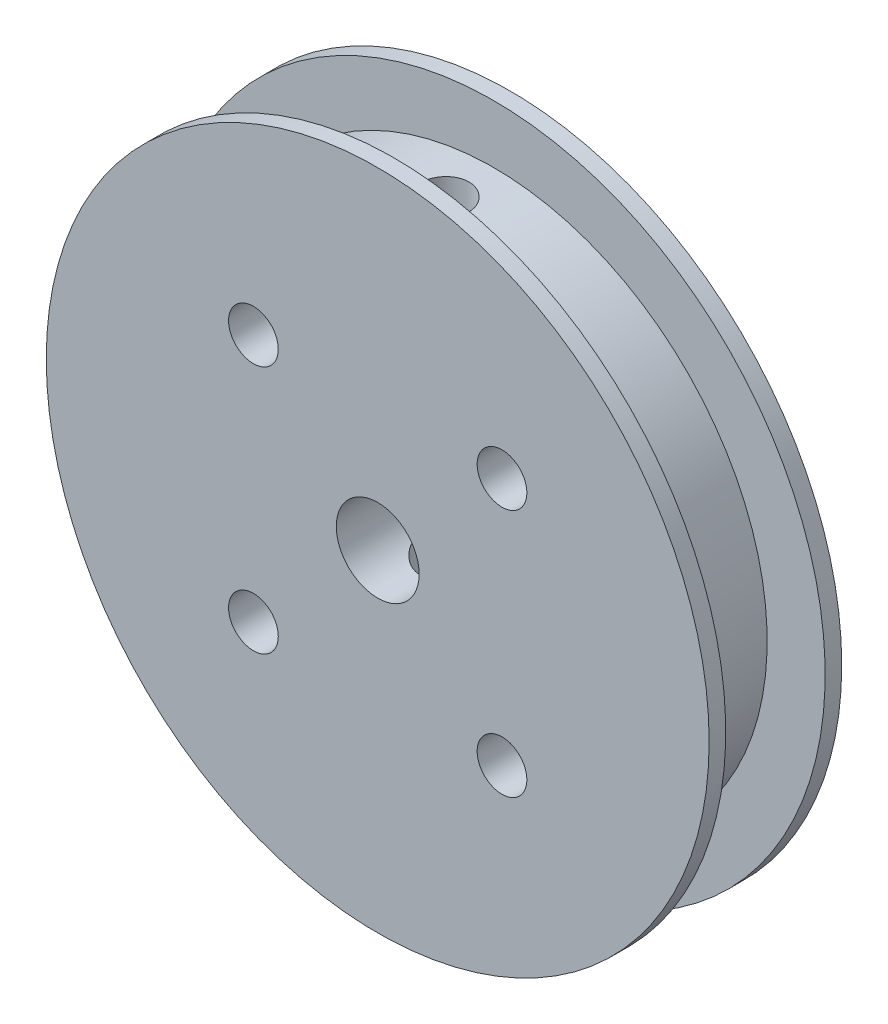
ISO-10303-21;
HEADER;
FILE_DESCRIPTION(('STEP AP214'),'2;1');
FILE_NAME('part.step','',(''),(''),'','','');
FILE_SCHEMA(('AUTOMOTIVE_DESIGN { 1 0 10303 214 1 1 1 1 }'));
ENDSEC;
DATA;
#1=APPLICATION_CONTEXT('core data for automotive mechanical design processes');
#2=APPLICATION_PROTOCOL_DEFINITION('international standard','automotive_design',2000,#1);
#3=PRODUCT_CONTEXT('',#1,'mechanical');
#4=PRODUCT('Part','Part','',(#3));
#5=PRODUCT_RELATED_PRODUCT_CATEGORY('part','',(#4));
#6=PRODUCT_DEFINITION_FORMATION('','',#4);
#7=PRODUCT_DEFINITION_CONTEXT('part definition',#1,'design');
#8=PRODUCT_DEFINITION('design','',#6,#7);
#9=PRODUCT_DEFINITION_SHAPE('','',#8);
#10=(LENGTH_UNIT() NAMED_UNIT(*) SI_UNIT(.MILLI.,.METRE.));
#11=(NAMED_UNIT(*) PLANE_ANGLE_UNIT() SI_UNIT($,.RADIAN.));
#12=(NAMED_UNIT(*) SI_UNIT($,.STERADIAN.) SOLID_ANGLE_UNIT());
#13=UNCERTAINTY_MEASURE_WITH_UNIT(LENGTH_MEASURE(1.E-05),#10,'distance_accuracy_value','');
#14=(GEOMETRIC_REPRESENTATION_CONTEXT(3) GLOBAL_UNCERTAINTY_ASSIGNED_CONTEXT((#13)) GLOBAL_UNIT_ASSIGNED_CONTEXT((#10,
#11,#12)) REPRESENTATION_CONTEXT('',''));
#15=CARTESIAN_POINT('',(0.,0.,0.));
#16=DIRECTION('',(0.,0.,1.));
#17=DIRECTION('',(1.,0.,0.));
#18=AXIS2_PLACEMENT_3D('',#15,#16,#17);
#19=CARTESIAN_POINT('',(0.,0.,8.));
#20=DIRECTION('',(0.,0.,1.));
#21=DIRECTION('',(1.,0.,0.));
#22=AXIS2_PLACEMENT_3D('',#19,#20,#21);
#23=PLANE('',#22);
#24=CARTESIAN_POINT('',(7.5,-7.5,8.));
#25=DIRECTION('',(0.,0.,1.));
#26=DIRECTION('',(1.,0.,0.));
#27=AXIS2_PLACEMENT_3D('',#24,#25,#26);
#28=CIRCLE('',#27,1.5);
#29=CARTESIAN_POINT('',(9.,-7.5,8.));
#30=VERTEX_POINT('',#29);
#31=EDGE_CURVE('E242',#30,#30,#28,.T.);
#32=ORIENTED_EDGE('',*,*,#31,.F.);
#33=EDGE_LOOP('',(#32));
#34=FACE_BOUND('',#33,.T.);
#35=CARTESIAN_POINT('',(-7.5,-7.5,8.));
#36=DIRECTION('',(0.,0.,1.));
#37=DIRECTION('',(1.,0.,0.));
#38=AXIS2_PLACEMENT_3D('',#35,#36,#37);
#39=CIRCLE('',#38,1.5);
#40=CARTESIAN_POINT('',(-6.,-7.5,8.));
#41=VERTEX_POINT('',#40);
#42=EDGE_CURVE('E244',#41,#41,#39,.T.);
#43=ORIENTED_EDGE('',*,*,#42,.F.);
#44=EDGE_LOOP('',(#43));
#45=FACE_BOUND('',#44,.T.);
#46=CARTESIAN_POINT('',(-7.5,7.5,8.));
#47=DIRECTION('',(0.,0.,1.));
#48=DIRECTION('',(1.,0.,0.));
#49=AXIS2_PLACEMENT_3D('',#46,#47,#48);
#50=CIRCLE('',#49,1.5);
#51=CARTESIAN_POINT('',(-6.,7.5,8.));
#52=VERTEX_POINT('',#51);
#53=EDGE_CURVE('E252',#52,#52,#50,.T.);
#54=ORIENTED_EDGE('',*,*,#53,.F.);
#55=EDGE_LOOP('',(#54));
#56=FACE_BOUND('',#55,.T.);
#57=CARTESIAN_POINT('',(7.5,7.5,8.));
#58=DIRECTION('',(0.,0.,1.));
#59=DIRECTION('',(1.,0.,0.));
#60=AXIS2_PLACEMENT_3D('',#57,#58,#59);
#61=CIRCLE('',#60,1.5);
#62=CARTESIAN_POINT('',(9.,7.5,8.));
#63=VERTEX_POINT('',#62);
#64=EDGE_CURVE('E258',#63,#63,#61,.T.);
#65=ORIENTED_EDGE('',*,*,#64,.F.);
#66=EDGE_LOOP('',(#65));
#67=FACE_BOUND('',#66,.T.);
#68=CARTESIAN_POINT('',(0.,0.,8.));
#69=DIRECTION('',(0.,0.,1.));
#70=DIRECTION('',(1.,0.,0.));
#71=AXIS2_PLACEMENT_3D('',#68,#69,#70);
#72=CIRCLE('',#71,20.);
#73=CARTESIAN_POINT('',(20.,0.,8.));
#74=VERTEX_POINT('',#73);
#75=EDGE_CURVE('E10',#74,#74,#72,.T.);
#76=ORIENTED_EDGE('',*,*,#75,.T.);
#77=EDGE_LOOP('',(#76));
#78=FACE_BOUND('',#77,.T.);
#79=CARTESIAN_POINT('',(0.,0.,8.));
#80=DIRECTION('',(0.,0.,1.));
#81=DIRECTION('',(1.,0.,0.));
#82=AXIS2_PLACEMENT_3D('',#79,#80,#81);
#83=CIRCLE('',#82,2.5);
#84=CARTESIAN_POINT('',(2.5,0.,8.));
#85=VERTEX_POINT('',#84);
#86=EDGE_CURVE('E87',#85,#85,#83,.T.);
#87=ORIENTED_EDGE('',*,*,#86,.F.);
#88=EDGE_LOOP('',(#87));
#89=FACE_BOUND('',#88,.T.);
#90=ADVANCED_FACE('F33',(#34,#45,#56,#67,#78,#89),#23,.T.);
#91=CARTESIAN_POINT('',(0.,0.,0.));
#92=DIRECTION('',(0.,0.,1.));
#93=DIRECTION('',(1.,0.,0.));
#94=AXIS2_PLACEMENT_3D('',#91,#92,#93);
#95=PLANE('',#94);
#96=CARTESIAN_POINT('',(7.5,-7.5,0.));
#97=DIRECTION('',(0.,0.,1.));
#98=DIRECTION('',(1.,0.,0.));
#99=AXIS2_PLACEMENT_3D('',#96,#97,#98);
#100=CIRCLE('',#99,1.5);
#101=CARTESIAN_POINT('',(9.,-7.5,0.));
#102=VERTEX_POINT('',#101);
#103=EDGE_CURVE('E240',#102,#102,#100,.F.);
#104=ORIENTED_EDGE('',*,*,#103,.F.);
#105=EDGE_LOOP('',(#104));
#106=FACE_BOUND('',#105,.T.);
#107=CARTESIAN_POINT('',(-7.5,-7.5,0.));
#108=DIRECTION('',(0.,0.,1.));
#109=DIRECTION('',(1.,0.,0.));
#110=AXIS2_PLACEMENT_3D('',#107,#108,#109);
#111=CIRCLE('',#110,1.5);
#112=CARTESIAN_POINT('',(-6.,-7.5,0.));
#113=VERTEX_POINT('',#112);
#114=EDGE_CURVE('E249',#113,#113,#111,.F.);
#115=ORIENTED_EDGE('',*,*,#114,.F.);
#116=EDGE_LOOP('',(#115));
#117=FACE_BOUND('',#116,.T.);
#118=CARTESIAN_POINT('',(-7.5,7.5,0.));
#119=DIRECTION('',(0.,0.,1.));
#120=DIRECTION('',(1.,0.,0.));
#121=AXIS2_PLACEMENT_3D('',#118,#119,#120);
#122=CIRCLE('',#121,1.5);
#123=CARTESIAN_POINT('',(-6.,7.5,0.));
#124=VERTEX_POINT('',#123);
#125=EDGE_CURVE('E255',#124,#124,#122,.F.);
#126=ORIENTED_EDGE('',*,*,#125,.F.);
#127=EDGE_LOOP('',(#126));
#128=FACE_BOUND('',#127,.T.);
#129=CARTESIAN_POINT('',(7.5,7.5,0.));
#130=DIRECTION('',(0.,0.,1.));
#131=DIRECTION('',(1.,0.,0.));
#132=AXIS2_PLACEMENT_3D('',#129,#130,#131);
#133=CIRCLE('',#132,1.5);
#134=CARTESIAN_POINT('',(9.,7.5,0.));
#135=VERTEX_POINT('',#134);
#136=EDGE_CURVE('E260',#135,#135,#133,.F.);
#137=ORIENTED_EDGE('',*,*,#136,.F.);
#138=EDGE_LOOP('',(#137));
#139=FACE_BOUND('',#138,.T.);
#140=CARTESIAN_POINT('',(0.,0.,0.));
#141=DIRECTION('',(0.,0.,1.));
#142=DIRECTION('',(1.,0.,0.));
#143=AXIS2_PLACEMENT_3D('',#140,#141,#142);
#144=CIRCLE('',#143,20.);
#145=CARTESIAN_POINT('',(20.,0.,0.));
#146=VERTEX_POINT('',#145);
#147=EDGE_CURVE('E45',#146,#146,#144,.T.);
#148=ORIENTED_EDGE('',*,*,#147,.F.);
#149=EDGE_LOOP('',(#148));
#150=FACE_BOUND('',#149,.T.);
#151=CARTESIAN_POINT('',(0.,0.,0.));
#152=DIRECTION('',(0.,0.,1.));
#153=DIRECTION('',(1.,0.,0.));
#154=AXIS2_PLACEMENT_3D('',#151,#152,#153);
#155=CIRCLE('',#154,2.5);
#156=CARTESIAN_POINT('',(2.5,0.,0.));
#157=VERTEX_POINT('',#156);
#158=EDGE_CURVE('E84',#157,#157,#155,.T.);
#159=ORIENTED_EDGE('',*,*,#158,.T.);
#160=EDGE_LOOP('',(#159));
#161=FACE_BOUND('',#160,.T.);
#162=ADVANCED_FACE('F106',(#106,#117,#128,#139,#150,#161),#95,.F.);
#163=CARTESIAN_POINT('',(0.,0.,8.));
#164=DIRECTION('',(0.,0.,-1.));
#165=DIRECTION('',(-1.,0.,0.));
#166=AXIS2_PLACEMENT_3D('',#163,#164,#165);
#167=CYLINDRICAL_SURFACE('',#166,20.);
#168=ORIENTED_EDGE('',*,*,#75,.F.);
#169=EDGE_LOOP('',(#168));
#170=FACE_BOUND('',#169,.T.);
#171=CARTESIAN_POINT('',(0.,0.,7.));
#172=DIRECTION('',(0.,0.,-1.));
#173=DIRECTION('',(-1.,0.,0.));
#174=AXIS2_PLACEMENT_3D('',#171,#172,#173);
#175=CIRCLE('',#174,20.);
#176=CARTESIAN_POINT('',(-20.,0.,7.00000000000001));
#177=VERTEX_POINT('',#176);
#178=EDGE_CURVE('E50',#177,#177,#175,.T.);
#179=ORIENTED_EDGE('',*,*,#178,.F.);
#180=EDGE_LOOP('',(#179));
#181=FACE_BOUND('',#180,.T.);
#182=ADVANCED_FACE('F35',(#170,#181),#167,.T.);
#183=CARTESIAN_POINT('',(20.,0.,7.));
#184=DIRECTION('',(0.,0.,-1.));
#185=DIRECTION('',(-1.,0.,0.));
#186=AXIS2_PLACEMENT_3D('',#183,#184,#185);
#187=PLANE('',#186);
#188=ORIENTED_EDGE('',*,*,#178,.T.);
#189=EDGE_LOOP('',(#188));
#190=FACE_BOUND('',#189,.T.);
#191=CARTESIAN_POINT('',(0.,0.,7.));
#192=DIRECTION('',(0.,0.,-1.));
#193=DIRECTION('',(-1.,0.,0.));
#194=AXIS2_PLACEMENT_3D('',#191,#192,#193);
#195=CIRCLE('',#194,16.5);
#196=CARTESIAN_POINT('',(-16.5,0.,7.00000000000001));
#197=VERTEX_POINT('',#196);
#198=EDGE_CURVE('E95',#197,#197,#195,.T.);
#199=ORIENTED_EDGE('',*,*,#198,.F.);
#200=EDGE_LOOP('',(#199));
#201=FACE_BOUND('',#200,.T.);
#202=ADVANCED_FACE('F102',(#190,#201),#187,.T.);
#203=CARTESIAN_POINT('',(0.,0.,-14.621584360084));
#204=DIRECTION('',(0.,0.,-1.));
#205=DIRECTION('',(-1.,0.,0.));
#206=AXIS2_PLACEMENT_3D('',#203,#204,#205);
#207=CYLINDRICAL_SURFACE('',#206,16.5);
#208=CARTESIAN_POINT('',(0.,-16.5,5.5));
#209=CARTESIAN_POINT('',(0.0840694776147628,-16.4999991126843,5.49999634110918));
#210=CARTESIAN_POINT('',(0.168195474457431,-16.499350643969,5.49290853975559));
#211=CARTESIAN_POINT('',(0.334117838865007,-16.4968261251589,5.46473940424852));
#212=CARTESIAN_POINT('',(0.41591149150502,-16.494948700883,5.44364240504991));
#213=CARTESIAN_POINT('',(0.57474222859728,-16.4901783294567,5.38807177765351));
#214=CARTESIAN_POINT('',(0.651782052754372,-16.4872859737774,5.35360593917686));
#215=CARTESIAN_POINT('',(0.798965391097574,-16.480809692352,5.27229045137129));
#216=CARTESIAN_POINT('',(0.869110331340956,-16.4772259100688,5.22544337025919));
#217=CARTESIAN_POINT('',(1.00074111688746,-16.4697565865552,5.12054375876211));
#218=CARTESIAN_POINT('',(1.06220337627144,-16.4658702662381,5.0624616849337));
#219=CARTESIAN_POINT('',(1.17452157790967,-16.458240374565,4.9368035499397));
#220=CARTESIAN_POINT('',(1.22537704378566,-16.4544968096265,4.8692270625837));
#221=CARTESIAN_POINT('',(1.31511966414836,-16.4475681181277,4.72635323858853));
#222=CARTESIAN_POINT('',(1.35398579793557,-16.4443839765542,4.65104264646243));
#223=CARTESIAN_POINT('',(1.4185122398563,-16.4389439365229,4.49493057768157));
#224=CARTESIAN_POINT('',(1.44417282127976,-16.4366880188556,4.41412921469791));
#225=CARTESIAN_POINT('',(1.4814906131316,-16.4333666426528,4.24956764674845));
#226=CARTESIAN_POINT('',(1.49318658794936,-16.4322978892429,4.16581630002516));
#227=CARTESIAN_POINT('',(1.50236294761345,-16.4314615273745,3.99753295770753));
#228=CARTESIAN_POINT('',(1.49984364535309,-16.4316938902772,3.91300097933661));
#229=CARTESIAN_POINT('',(1.48069296296741,-16.4334305053693,3.74582225095403));
#230=CARTESIAN_POINT('',(1.4641037962392,-16.4349309529146,3.66317062024788));
#231=CARTESIAN_POINT('',(1.41734991676827,-16.4390287189926,3.50182967927257));
#232=CARTESIAN_POINT('',(1.3871850494017,-16.4416260500187,3.42314041414512));
#233=CARTESIAN_POINT('',(1.31408906355099,-16.4476293101993,3.27182388420785));
#234=CARTESIAN_POINT('',(1.27113909690302,-16.4510364316651,3.19920577354298));
#235=CARTESIAN_POINT('',(1.17370567210692,-16.4582743186583,3.06219304865277));
#236=CARTESIAN_POINT('',(1.11922193539003,-16.462105094417,2.99779863311003));
#237=CARTESIAN_POINT('',(1.00003122884984,-16.4697755990843,2.87881583481883));
#238=CARTESIAN_POINT('',(0.935287781192217,-16.473615309851,2.82426398579776));
#239=CARTESIAN_POINT('',(0.797542484554325,-16.4808578201104,2.72679761764894));
#240=CARTESIAN_POINT('',(0.724540628575122,-16.4842606192328,2.68388310838383));
#241=CARTESIAN_POINT('',(0.572326346138815,-16.490246747037,2.61091152973324));
#242=CARTESIAN_POINT('',(0.493113090610194,-16.4928299660917,2.58085618020281));
#243=CARTESIAN_POINT('',(0.330735928689836,-16.4968846855164,2.53448217700121));
#244=CARTESIAN_POINT('',(0.247572119948099,-16.49835621335,2.51816318398043));
#245=CARTESIAN_POINT('',(0.0799711112675482,-16.5000182243561,2.49977116936316));
#246=CARTESIAN_POINT('',(-0.00446051031089689,-16.5002132433369,2.49764770633208));
#247=CARTESIAN_POINT('',(-0.172478495714505,-16.4993123985291,2.50757474130288));
#248=CARTESIAN_POINT('',(-0.256064868937162,-16.4982165491082,2.51962508154487));
#249=CARTESIAN_POINT('',(-0.419875060061017,-16.494860076415,2.5575158332657));
#250=CARTESIAN_POINT('',(-0.500104353881956,-16.492601436858,2.58333276167447));
#251=CARTESIAN_POINT('',(-0.655092849476839,-16.4871729623566,2.64799979326016));
#252=CARTESIAN_POINT('',(-0.72985194895119,-16.4840031103768,2.68685014010272));
#253=CARTESIAN_POINT('',(-0.872006827724035,-16.4770959086222,2.77660722978271));
#254=CARTESIAN_POINT('',(-0.939381506047918,-16.4733570019429,2.82754727008251));
#255=CARTESIAN_POINT('',(-1.0646417650795,-16.4657366518484,2.93998980104474));
#256=CARTESIAN_POINT('',(-1.12252714938048,-16.461855205485,3.00149251027638));
#257=CARTESIAN_POINT('',(-1.22733960617903,-16.4543737143673,3.13353395325295));
#258=CARTESIAN_POINT('',(-1.27423368050041,-16.4507745380349,3.2040989365138));
#259=CARTESIAN_POINT('',(-1.35550585729767,-16.4442778250686,3.35213170401521));
#260=CARTESIAN_POINT('',(-1.38988410492666,-16.4413802802975,3.42959940818804));
#261=CARTESIAN_POINT('',(-1.44509296312353,-16.4366200392044,3.5891233426928));
#262=CARTESIAN_POINT('',(-1.46594352857953,-16.4347558192037,3.67117261959882));
#263=CARTESIAN_POINT('',(-1.49357002653857,-16.4322683772433,3.83762526610443));
#264=CARTESIAN_POINT('',(-1.5003462866924,-16.4316451263936,3.9220285808555));
#265=CARTESIAN_POINT('',(-1.49962771178473,-16.4317106975547,4.09046545881802));
#266=CARTESIAN_POINT('',(-1.49218471796755,-16.4323947533271,4.17449924988598));
#267=CARTESIAN_POINT('',(-1.46334727211893,-16.4349877202763,4.3401177490326));
#268=CARTESIAN_POINT('',(-1.44195280103252,-16.4368966331262,4.42170245376614));
#269=CARTESIAN_POINT('',(-1.38583336555098,-16.4417229455161,4.58010860431203));
#270=CARTESIAN_POINT('',(-1.35110959671977,-16.4446402546064,4.65693047660639));
#271=CARTESIAN_POINT('',(-1.26932281385836,-16.4511548261164,4.80366323198922));
#272=CARTESIAN_POINT('',(-1.22225993942505,-16.4547520808436,4.87357419325108));
#273=CARTESIAN_POINT('',(-1.11693597558464,-16.4622368830709,5.00476618029248));
#274=CARTESIAN_POINT('',(-1.05863636147767,-16.4661254002722,5.06601622251875));
#275=CARTESIAN_POINT('',(-0.932567082454746,-16.4737457112074,5.1778885982774));
#276=CARTESIAN_POINT('',(-0.864795139742519,-16.4774774669636,5.22850836821598));
#277=CARTESIAN_POINT('',(-0.721550487336606,-16.484371806997,5.31776490774993));
#278=CARTESIAN_POINT('',(-0.646061596831514,-16.4875331552461,5.35637578291104));
#279=CARTESIAN_POINT('',(-0.48969347144512,-16.4929165154923,5.42032377800947));
#280=CARTESIAN_POINT('',(-0.408820500863551,-16.4951395977769,5.44567603010438));
#281=CARTESIAN_POINT('',(-0.272898846401497,-16.4978304640647,5.47598861803314));
#282=CARTESIAN_POINT('',(-0.21872210546774,-16.4986402975187,5.48498077437193));
#283=CARTESIAN_POINT('',(-0.109704932063507,-16.4997253541486,5.49698764950828));
#284=CARTESIAN_POINT('',(-0.054864501760915,-16.5000005790702,5.50000238782525));
#285=CARTESIAN_POINT('',(0.,-16.5,5.5));
#286=B_SPLINE_CURVE_WITH_KNOTS('',3,(#208,#209,#210,#211,#212,#213,#214,#215,#216,#217,#218,
#219,#220,#221,#222,#223,#224,#225,#226,#227,#228,#229,#230,#231,#232,#233,#234,#235,#236,#237,
#238,#239,#240,#241,#242,#243,#244,#245,#246,#247,#248,#249,#250,#251,#252,#253,#254,#255,#256,
#257,#258,#259,#260,#261,#262,#263,#264,#265,#266,#267,#268,#269,#270,#271,#272,#273,#274,#275,
#276,#277,#278,#279,#280,#281,#282,#283,#284,#285),.UNSPECIFIED.,.T.,.F.,(4,2,2,2,2,2,2,2,2,2,2,
2,2,2,2,2,2,2,2,2,2,2,2,2,2,2,2,2,2,2,2,2,2,2,2,2,2,2,4),(0.,0.252008104940992,
0.504298480221776,0.756442071884731,1.00853340289149,1.26129687114407,1.51407168920787,
1.76728720681692,2.02049748390016,2.27300322747119,2.52550341314495,2.77724869902051,
3.02899685228487,3.28111799367152,3.5332452250956,3.78628987003456,4.03933472942837,
4.29241342186823,4.54548586194629,4.79765857136287,5.04982847402683,5.30156959444426,
5.55331542153825,5.8057628228266,6.05821544854019,6.31141654934034,6.56461471353072,
6.81743852694191,7.07025645453141,7.32215440501879,7.57405269954999,7.82592840548182,
8.07780126197316,8.33055352919803,8.58336668027647,8.83672124513352,9.08978602015434,
9.2542493266949,9.41871209617537),.UNSPECIFIED.);
#287=CARTESIAN_POINT('',(0.,-16.5,5.5));
#288=VERTEX_POINT('',#287);
#289=EDGE_CURVE('E58',#288,#288,#286,.T.);
#290=ORIENTED_EDGE('',*,*,#289,.T.);
#291=EDGE_LOOP('',(#290));
#292=FACE_BOUND('',#291,.T.);
#293=CARTESIAN_POINT('',(0.,16.5,2.5));
#294=CARTESIAN_POINT('',(-0.0840694776147618,16.4999991126843,2.50000365889082));
#295=CARTESIAN_POINT('',(-0.16819547445743,16.499350643969,2.5070914602444));
#296=CARTESIAN_POINT('',(-0.334117838865006,16.4968261251589,2.53526059575148));
#297=CARTESIAN_POINT('',(-0.415911491505019,16.494948700883,2.55635759495009));
#298=CARTESIAN_POINT('',(-0.574742228597279,16.4901783294567,2.61192822234648));
#299=CARTESIAN_POINT('',(-0.651782052754371,16.4872859737774,2.64639406082314));
#300=CARTESIAN_POINT('',(-0.798965391097573,16.480809692352,2.72770954862871));
#301=CARTESIAN_POINT('',(-0.869110331340955,16.4772259100688,2.77455662974081));
#302=CARTESIAN_POINT('',(-1.00074111688746,16.4697565865552,2.87945624123789));
#303=CARTESIAN_POINT('',(-1.06220337627144,16.4658702662381,2.9375383150663));
#304=CARTESIAN_POINT('',(-1.17452157790967,16.458240374565,3.0631964500603));
#305=CARTESIAN_POINT('',(-1.22537704378566,16.4544968096265,3.1307729374163));
#306=CARTESIAN_POINT('',(-1.31511966414836,16.4475681181277,3.27364676141147));
#307=CARTESIAN_POINT('',(-1.35398579793557,16.4443839765542,3.34895735353757));
#308=CARTESIAN_POINT('',(-1.4185122398563,16.4389439365229,3.50506942231843));
#309=CARTESIAN_POINT('',(-1.44417282127976,16.4366880188556,3.58587078530209));
#310=CARTESIAN_POINT('',(-1.4814906131316,16.4333666426528,3.75043235325155));
#311=CARTESIAN_POINT('',(-1.49318658794936,16.4322978892429,3.83418369997483));
#312=CARTESIAN_POINT('',(-1.50236294761345,16.4314615273745,4.00246704229247));
#313=CARTESIAN_POINT('',(-1.49984364535309,16.4316938902772,4.08699902066339));
#314=CARTESIAN_POINT('',(-1.48069296296741,16.4334305053693,4.25417774904597));
#315=CARTESIAN_POINT('',(-1.4641037962392,16.4349309529146,4.33682937975212));
#316=CARTESIAN_POINT('',(-1.41734991676827,16.4390287189926,4.49817032072743));
#317=CARTESIAN_POINT('',(-1.3871850494017,16.4416260500187,4.57685958585488));
#318=CARTESIAN_POINT('',(-1.31408906355099,16.4476293101993,4.72817611579215));
#319=CARTESIAN_POINT('',(-1.27113909690302,16.4510364316651,4.80079422645702));
#320=CARTESIAN_POINT('',(-1.17370567210692,16.4582743186583,4.93780695134723));
#321=CARTESIAN_POINT('',(-1.11922193539002,16.462105094417,5.00220136688997));
#322=CARTESIAN_POINT('',(-1.00003122884984,16.4697755990843,5.12118416518117));
#323=CARTESIAN_POINT('',(-0.935287781192216,16.473615309851,5.17573601420224));
#324=CARTESIAN_POINT('',(-0.797542484554324,16.4808578201104,5.27320238235106));
#325=CARTESIAN_POINT('',(-0.724540628575121,16.4842606192328,5.31611689161617));
#326=CARTESIAN_POINT('',(-0.572326346138814,16.490246747037,5.38908847026676));
#327=CARTESIAN_POINT('',(-0.493113090610193,16.4928299660917,5.41914381979719));
#328=CARTESIAN_POINT('',(-0.330735928689835,16.4968846855164,5.46551782299879));
#329=CARTESIAN_POINT('',(-0.247572119948098,16.49835621335,5.48183681601956));
#330=CARTESIAN_POINT('',(-0.079971111267547,16.5000182243561,5.50022883063684));
#331=CARTESIAN_POINT('',(0.00446051031089807,16.5002132433369,5.50235229366792));
#332=CARTESIAN_POINT('',(0.172478495714506,16.4993123985291,5.49242525869712));
#333=CARTESIAN_POINT('',(0.256064868937163,16.4982165491082,5.48037491845513));
#334=CARTESIAN_POINT('',(0.419875060061018,16.494860076415,5.4424841667343));
#335=CARTESIAN_POINT('',(0.500104353881958,16.492601436858,5.41666723832552));
#336=CARTESIAN_POINT('',(0.655092849476841,16.4871729623566,5.35200020673984));
#337=CARTESIAN_POINT('',(0.729851948951192,16.4840031103768,5.31314985989728));
#338=CARTESIAN_POINT('',(0.872006827724036,16.4770959086222,5.22339277021728));
#339=CARTESIAN_POINT('',(0.939381506047919,16.4733570019429,5.17245272991749));
#340=CARTESIAN_POINT('',(1.0646417650795,16.4657366518484,5.06001019895525));
#341=CARTESIAN_POINT('',(1.12252714938048,16.461855205485,4.99850748972361));
#342=CARTESIAN_POINT('',(1.22733960617903,16.4543737143673,4.86646604674705));
#343=CARTESIAN_POINT('',(1.27423368050041,16.4507745380349,4.7959010634862));
#344=CARTESIAN_POINT('',(1.35550585729767,16.4442778250686,4.64786829598479));
#345=CARTESIAN_POINT('',(1.38988410492666,16.4413802802975,4.57040059181196));
#346=CARTESIAN_POINT('',(1.44509296312353,16.4366200392044,4.4108766573072));
#347=CARTESIAN_POINT('',(1.46594352857953,16.4347558192037,4.32882738040118));
#348=CARTESIAN_POINT('',(1.49357002653857,16.4322683772433,4.16237473389557));
#349=CARTESIAN_POINT('',(1.5003462866924,16.4316451263936,4.0779714191445));
#350=CARTESIAN_POINT('',(1.49962771178473,16.4317106975547,3.90953454118198));
#351=CARTESIAN_POINT('',(1.49218471796755,16.4323947533271,3.82550075011402));
#352=CARTESIAN_POINT('',(1.46334727211893,16.4349877202763,3.65988225096739));
#353=CARTESIAN_POINT('',(1.44195280103252,16.4368966331262,3.57829754623386));
#354=CARTESIAN_POINT('',(1.38583336555098,16.4417229455161,3.41989139568797));
#355=CARTESIAN_POINT('',(1.35110959671977,16.4446402546064,3.34306952339361));
#356=CARTESIAN_POINT('',(1.26932281385836,16.4511548261164,3.19633676801078));
#357=CARTESIAN_POINT('',(1.22225993942505,16.4547520808436,3.12642580674892));
#358=CARTESIAN_POINT('',(1.11693597558464,16.4622368830709,2.99523381970752));
#359=CARTESIAN_POINT('',(1.05863636147768,16.4661254002722,2.93398377748125));
#360=CARTESIAN_POINT('',(0.932567082454748,16.4737457112074,2.8221114017226));
#361=CARTESIAN_POINT('',(0.864795139742521,16.4774774669636,2.77149163178402));
#362=CARTESIAN_POINT('',(0.721550487336606,16.484371806997,2.68223509225007));
#363=CARTESIAN_POINT('',(0.646061596831514,16.4875331552461,2.64362421708896));
#364=CARTESIAN_POINT('',(0.48969347144512,16.4929165154923,2.57967622199053));
#365=CARTESIAN_POINT('',(0.408820500863551,16.4951395977769,2.55432396989562));
#366=CARTESIAN_POINT('',(0.272898846401498,16.4978304640647,2.52401138196686));
#367=CARTESIAN_POINT('',(0.218722105467741,16.4986402975187,2.51501922562807));
#368=CARTESIAN_POINT('',(0.109704932063508,16.4997253541486,2.50301235049172));
#369=CARTESIAN_POINT('',(0.0548645017609162,16.5000005790702,2.49999761217474));
#370=CARTESIAN_POINT('',(0.,16.5,2.5));
#371=B_SPLINE_CURVE_WITH_KNOTS('',3,(#293,#294,#295,#296,#297,#298,#299,#300,#301,#302,#303,
#304,#305,#306,#307,#308,#309,#310,#311,#312,#313,#314,#315,#316,#317,#318,#319,#320,#321,#322,
#323,#324,#325,#326,#327,#328,#329,#330,#331,#332,#333,#334,#335,#336,#337,#338,#339,#340,#341,
#342,#343,#344,#345,#346,#347,#348,#349,#350,#351,#352,#353,#354,#355,#356,#357,#358,#359,#360,
#361,#362,#363,#364,#365,#366,#367,#368,#369,#370),.UNSPECIFIED.,.T.,.F.,(4,2,2,2,2,2,2,2,2,2,2,
2,2,2,2,2,2,2,2,2,2,2,2,2,2,2,2,2,2,2,2,2,2,2,2,2,2,2,4),(0.,0.252008104940992,
0.504298480221776,0.756442071884731,1.00853340289149,1.26129687114407,1.51407168920787,
1.76728720681693,2.02049748390016,2.27300322747119,2.52550341314495,2.77724869902051,
3.02899685228487,3.28111799367152,3.5332452250956,3.78628987003456,4.03933472942837,
4.29241342186823,4.54548586194629,4.79765857136287,5.04982847402683,5.30156959444426,
5.55331542153825,5.8057628228266,6.05821544854019,6.31141654934034,6.56461471353072,
6.81743852694191,7.07025645453141,7.32215440501879,7.57405269954999,7.82592840548182,
8.07780126197316,8.33055352919803,8.58336668027647,8.83672124513353,9.08978602015435,
9.2542493266949,9.41871209617537),.UNSPECIFIED.);
#372=CARTESIAN_POINT('',(0.,16.5,2.5));
#373=VERTEX_POINT('',#372);
#374=EDGE_CURVE('E80',#373,#373,#371,.T.);
#375=ORIENTED_EDGE('',*,*,#374,.F.);
#376=EDGE_LOOP('',(#375));
#377=FACE_BOUND('',#376,.T.);
#378=ORIENTED_EDGE('',*,*,#198,.T.);
#379=EDGE_LOOP('',(#378));
#380=FACE_BOUND('',#379,.T.);
#381=CARTESIAN_POINT('',(0.,0.,1.));
#382=DIRECTION('',(0.,0.,-1.));
#383=DIRECTION('',(-1.,0.,0.));
#384=AXIS2_PLACEMENT_3D('',#381,#382,#383);
#385=CIRCLE('',#384,16.5);
#386=CARTESIAN_POINT('',(-16.5,0.,1.));
#387=VERTEX_POINT('',#386);
#388=EDGE_CURVE('E93',#387,#387,#385,.T.);
#389=ORIENTED_EDGE('',*,*,#388,.F.);
#390=EDGE_LOOP('',(#389));
#391=FACE_BOUND('',#390,.T.);
#392=ADVANCED_FACE('F113',(#292,#377,#380,#391),#207,.T.);
#393=CARTESIAN_POINT('',(20.,0.,1.));
#394=DIRECTION('',(0.,0.,1.));
#395=DIRECTION('',(1.,0.,0.));
#396=AXIS2_PLACEMENT_3D('',#393,#394,#395);
#397=PLANE('',#396);
#398=ORIENTED_EDGE('',*,*,#388,.T.);
#399=EDGE_LOOP('',(#398));
#400=FACE_BOUND('',#399,.T.);
#401=CARTESIAN_POINT('',(0.,0.,1.));
#402=DIRECTION('',(0.,0.,-1.));
#403=DIRECTION('',(-1.,0.,0.));
#404=AXIS2_PLACEMENT_3D('',#401,#402,#403);
#405=CIRCLE('',#404,20.);
#406=CARTESIAN_POINT('',(-20.,0.,1.00000000000001));
#407=VERTEX_POINT('',#406);
#408=EDGE_CURVE('E90',#407,#407,#405,.T.);
#409=ORIENTED_EDGE('',*,*,#408,.F.);
#410=EDGE_LOOP('',(#409));
#411=FACE_BOUND('',#410,.T.);
#412=ADVANCED_FACE('F117',(#400,#411),#397,.T.);
#413=ORIENTED_EDGE('',*,*,#147,.T.);
#414=EDGE_LOOP('',(#413));
#415=FACE_BOUND('',#414,.T.);
#416=ORIENTED_EDGE('',*,*,#408,.T.);
#417=EDGE_LOOP('',(#416));
#418=FACE_BOUND('',#417,.T.);
#419=ADVANCED_FACE('F108',(#415,#418),#167,.T.);
#420=CARTESIAN_POINT('',(0.,0.,15.0710678118655));
#421=DIRECTION('',(0.,0.,-1.));
#422=DIRECTION('',(-1.,0.,0.));
#423=AXIS2_PLACEMENT_3D('',#420,#421,#422);
#424=CYLINDRICAL_SURFACE('',#423,2.5);
#425=CARTESIAN_POINT('',(0.,-2.5,5.5));
#426=CARTESIAN_POINT('',(0.0767298334620163,-2.49999625789732,5.49999590899012));
#427=CARTESIAN_POINT('',(0.153582320644178,-2.4964290461501,5.49407132907374));
#428=CARTESIAN_POINT('',(0.304975509530679,-2.48249903608568,5.47067568048467));
#429=CARTESIAN_POINT('',(0.379510034596047,-2.47211948032719,5.45317613814577));
#430=CARTESIAN_POINT('',(0.523751827790837,-2.44561558054488,5.40761363883314));
#431=CARTESIAN_POINT('',(0.593481028226566,-2.42951973272944,5.37960304183684));
#432=CARTESIAN_POINT('',(0.727030318214659,-2.39295367626407,5.31413966685897));
#433=CARTESIAN_POINT('',(0.790851869416383,-2.37248455380255,5.27668923303125));
#434=CARTESIAN_POINT('',(0.916299278999315,-2.32705360719088,5.19022517329142));
#435=CARTESIAN_POINT('',(0.977384020081415,-2.30186792195985,5.14054630464861));
#436=CARTESIAN_POINT('',(1.09088270411891,-2.25030439279634,5.03253279617173));
#437=CARTESIAN_POINT('',(1.14328534948112,-2.22392505153571,4.97418706281268));
#438=CARTESIAN_POINT('',(1.24444996762974,-2.1691106699591,4.84207648950327));
#439=CARTESIAN_POINT('',(1.29197766378809,-2.14082017703649,4.76729822901871));
#440=CARTESIAN_POINT('',(1.37361437764896,-2.08938301412124,4.60915342675688));
#441=CARTESIAN_POINT('',(1.4077451733516,-2.06622802273938,4.52580110375243));
#442=CARTESIAN_POINT('',(1.45440601714222,-2.0335462966093,4.37340354934676));
#443=CARTESIAN_POINT('',(1.47016197246826,-2.02207883137591,4.30576400138968));
#444=CARTESIAN_POINT('',(1.49216172340475,-2.00590308295503,4.16819628416964));
#445=CARTESIAN_POINT('',(1.49841734556836,-2.00118639643759,4.09827107124551));
#446=CARTESIAN_POINT('',(1.50105508796009,-1.99920922463856,3.95798850578266));
#447=CARTESIAN_POINT('',(1.49741783408419,-2.00196337012718,3.8876305749068));
#448=CARTESIAN_POINT('',(1.48046060478828,-2.01453261443741,3.74872122457241));
#449=CARTESIAN_POINT('',(1.46713334620103,-2.02435302432226,3.68017120415256));
#450=CARTESIAN_POINT('',(1.43173921881792,-2.04953186944258,3.54746975787189));
#451=CARTESIAN_POINT('',(1.40978748666087,-2.06481711652537,3.48327294607552));
#452=CARTESIAN_POINT('',(1.35795061770837,-2.09927051350828,3.35930500907188));
#453=CARTESIAN_POINT('',(1.32806257259705,-2.11844008623465,3.29953551657607));
#454=CARTESIAN_POINT('',(1.25517983184583,-2.16255327268985,3.1750159028772));
#455=CARTESIAN_POINT('',(1.21080724397723,-2.18792043372992,3.11122190704507));
#456=CARTESIAN_POINT('',(1.11291092784003,-2.23930599764381,2.99132351633298));
#457=CARTESIAN_POINT('',(1.05937845100579,-2.26532500262149,2.93522656602349));
#458=CARTESIAN_POINT('',(0.935811834382967,-2.31935504958317,2.82438701817824));
#459=CARTESIAN_POINT('',(0.864517682704957,-2.34713836268532,2.77092269398401));
#460=CARTESIAN_POINT('',(0.712276050459,-2.39772428433981,2.67687795280209));
#461=CARTESIAN_POINT('',(0.631333763943565,-2.42052955425515,2.63629064621005));
#462=CARTESIAN_POINT('',(0.467197585268207,-2.45730392066151,2.5720678172041));
#463=CARTESIAN_POINT('',(0.384467624173581,-2.47173957439704,2.54752464428409));
#464=CARTESIAN_POINT('',(0.215047895144641,-2.49218842813551,2.51298880259462));
#465=CARTESIAN_POINT('',(0.12836300566132,-2.49821172952738,2.50297868224642));
#466=CARTESIAN_POINT('',(-0.0337146143773951,-2.5009057037461,2.49849215232169));
#467=CARTESIAN_POINT('',(-0.109042473418717,-2.49873521714286,2.50209114491483));
#468=CARTESIAN_POINT('',(-0.257829401986059,-2.48778712087048,2.52042585307192));
#469=CARTESIAN_POINT('',(-0.331288509376104,-2.47900964518037,2.53516134280581));
#470=CARTESIAN_POINT('',(-0.472574932157611,-2.4559479244219,2.57454343281246));
#471=CARTESIAN_POINT('',(-0.540495750928482,-2.44180275662555,2.59894034907347));
#472=CARTESIAN_POINT('',(-0.671265749087261,-2.40913880862845,2.65667737636527));
#473=CARTESIAN_POINT('',(-0.734113924963907,-2.39061916586511,2.69001925134667));
#474=CARTESIAN_POINT('',(-0.860006262823862,-2.3484549623736,2.7685569792087));
#475=CARTESIAN_POINT('',(-0.922394150456836,-2.3244780273988,2.81462382907839));
#476=CARTESIAN_POINT('',(-1.03902603131014,-2.27474265574732,2.91539139348862));
#477=CARTESIAN_POINT('',(-1.09326040273738,-2.24898216586361,2.97010215485253));
#478=CARTESIAN_POINT('',(-1.19931996735579,-2.19445423909891,3.09491039003715));
#479=CARTESIAN_POINT('',(-1.24991019630915,-2.16573241746291,3.1660838854655));
#480=CARTESIAN_POINT('',(-1.33845238915667,-2.1121618206671,3.3172160245682));
#481=CARTESIAN_POINT('',(-1.37641766769781,-2.0873089799769,3.39716529389278));
#482=CARTESIAN_POINT('',(-1.43142578795776,-2.04984909240519,3.54624302230669));
#483=CARTESIAN_POINT('',(-1.4512162533619,-2.03575659328729,3.61398031235859));
#484=CARTESIAN_POINT('',(-1.48113663905972,-2.01409605743544,3.7525320780801));
#485=CARTESIAN_POINT('',(-1.4912799529763,-2.00651897642721,3.82334214432783));
#486=CARTESIAN_POINT('',(-1.50134130416631,-1.99900446616268,3.96637694759703));
#487=CARTESIAN_POINT('',(-1.50122089107869,-1.99909576445937,4.03860599068704));
#488=CARTESIAN_POINT('',(-1.49066472959328,-2.0069771789285,4.18189443560946));
#489=CARTESIAN_POINT('',(-1.48022337215759,-2.0147714813882,4.25295318008059));
#490=CARTESIAN_POINT('',(-1.45040174148913,-2.0363318524298,4.38848841757218));
#491=CARTESIAN_POINT('',(-1.43147636845351,-2.04979211805581,4.45311709430687));
#492=CARTESIAN_POINT('',(-1.38563242076993,-2.08105501960152,4.57833725447422));
#493=CARTESIAN_POINT('',(-1.35871083588479,-2.09885929040482,4.63892720696055));
#494=CARTESIAN_POINT('',(-1.29289245555732,-2.14012990550917,4.76431985722078));
#495=CARTESIAN_POINT('',(-1.25279167675753,-2.16404587582639,4.82834110385431));
#496=CARTESIAN_POINT('',(-1.16375698389085,-2.21320127030768,4.94938007261729));
#497=CARTESIAN_POINT('',(-1.11481579607798,-2.23844177205021,5.00639196215255));
#498=CARTESIAN_POINT('',(-1.00009777425734,-2.29225690291476,5.12135094913167));
#499=CARTESIAN_POINT('',(-0.932876819313905,-2.32070308663658,5.17793107489619));
#500=CARTESIAN_POINT('',(-0.78846243444559,-2.37365428872367,5.2790978558633));
#501=CARTESIAN_POINT('',(-0.711265444501541,-2.39815789310936,5.32368021198479));
#502=CARTESIAN_POINT('',(-0.551125230801455,-2.43985578654394,5.39778580757374));
#503=CARTESIAN_POINT('',(-0.468430086957215,-2.45725077479787,5.42772806492683));
#504=CARTESIAN_POINT('',(-0.297973306118809,-2.48366273001246,5.47272469521097));
#505=CARTESIAN_POINT('',(-0.210232099648614,-2.49271125871485,5.48783516785699));
#506=CARTESIAN_POINT('',(-0.101558096917538,-2.49802001168187,5.49669745470866));
#507=CARTESIAN_POINT('',(-0.0812762590282788,-2.49876114656362,5.49793441730609));
#508=CARTESIAN_POINT('',(-0.0406658206871131,-2.49975164517367,5.49958624637086));
#509=CARTESIAN_POINT('',(-0.0203372186375695,-2.50000099184316,5.5000010843209));
#510=CARTESIAN_POINT('',(0.,-2.5,5.5));
#511=B_SPLINE_CURVE_WITH_KNOTS('',3,(#425,#426,#427,#428,#429,#430,#431,#432,#433,#434,#435,
#436,#437,#438,#439,#440,#441,#442,#443,#444,#445,#446,#447,#448,#449,#450,#451,#452,#453,#454,
#455,#456,#457,#458,#459,#460,#461,#462,#463,#464,#465,#466,#467,#468,#469,#470,#471,#472,#473,
#474,#475,#476,#477,#478,#479,#480,#481,#482,#483,#484,#485,#486,#487,#488,#489,#490,#491,#492,
#493,#494,#495,#496,#497,#498,#499,#500,#501,#502,#503,#504,#505,#506,#507,#508,#509,#510),
.UNSPECIFIED.,.T.,.F.,(4,2,2,2,2,2,2,2,2,2,2,2,2,2,2,2,2,2,2,2,2,2,2,2,2,2,2,2,2,2,2,2,2,2,2,2,
2,2,2,2,2,2,4),(0.,0.230102237548649,0.460772627520012,0.690308884600012,0.919788197992274,
1.16681590732472,1.414162579348,1.69183813189807,1.96906040692092,2.17933829855633,
2.38935420916578,2.59978170870726,2.81036753273872,3.01823267593207,3.22617409809868,
3.47046995225163,3.71500044803674,3.99360957884691,4.27206939275324,4.53296790696559,
4.79355286918236,5.01875602722426,5.24395461863455,5.46367785689772,5.68344445659025,
5.92601365818362,6.16886690081836,6.44336762428009,6.71757792616456,6.93257787314692,
7.14727888733318,7.36278425777433,7.57840681155725,7.78364098331141,7.98895251523034,
8.22578610052285,8.46281544370207,8.73854311775518,9.01436946031984,9.28175654462676,
9.54812832184447,9.60911473335176,9.6701032602764),.UNSPECIFIED.);
#512=CARTESIAN_POINT('',(0.,-2.5,5.5));
#513=VERTEX_POINT('',#512);
#514=EDGE_CURVE('E37',#513,#513,#511,.T.);
#515=ORIENTED_EDGE('',*,*,#514,.F.);
#516=EDGE_LOOP('',(#515));
#517=FACE_BOUND('',#516,.T.);
#518=CARTESIAN_POINT('',(0.,2.5,5.5));
#519=CARTESIAN_POINT('',(-0.0767298334620153,2.49999625789732,5.49999590899012));
#520=CARTESIAN_POINT('',(-0.153582320644177,2.4964290461501,5.49407132907374));
#521=CARTESIAN_POINT('',(-0.304975509530678,2.48249903608568,5.47067568048467));
#522=CARTESIAN_POINT('',(-0.379510034596046,2.47211948032719,5.45317613814577));
#523=CARTESIAN_POINT('',(-0.523751827790836,2.44561558054488,5.40761363883314));
#524=CARTESIAN_POINT('',(-0.593481028226565,2.42951973272944,5.37960304183684));
#525=CARTESIAN_POINT('',(-0.727030318214658,2.39295367626407,5.31413966685897));
#526=CARTESIAN_POINT('',(-0.790851869416382,2.37248455380255,5.27668923303125));
#527=CARTESIAN_POINT('',(-0.916299278999314,2.32705360719088,5.19022517329142));
#528=CARTESIAN_POINT('',(-0.977384020081415,2.30186792195985,5.14054630464861));
#529=CARTESIAN_POINT('',(-1.09088270411891,2.25030439279634,5.03253279617173));
#530=CARTESIAN_POINT('',(-1.14328534948112,2.22392505153571,4.97418706281268));
#531=CARTESIAN_POINT('',(-1.24444996762974,2.1691106699591,4.84207648950327));
#532=CARTESIAN_POINT('',(-1.29197766378809,2.14082017703649,4.76729822901871));
#533=CARTESIAN_POINT('',(-1.37361437764896,2.08938301412124,4.60915342675688));
#534=CARTESIAN_POINT('',(-1.4077451733516,2.06622802273938,4.52580110375243));
#535=CARTESIAN_POINT('',(-1.45440601714221,2.0335462966093,4.37340354934676));
#536=CARTESIAN_POINT('',(-1.47016197246826,2.02207883137591,4.30576400138968));
#537=CARTESIAN_POINT('',(-1.49216172340475,2.00590308295503,4.16819628416964));
#538=CARTESIAN_POINT('',(-1.49841734556836,2.0011863964376,4.09827107124551));
#539=CARTESIAN_POINT('',(-1.50105508796009,1.99920922463856,3.95798850578266));
#540=CARTESIAN_POINT('',(-1.49741783408418,2.00196337012718,3.8876305749068));
#541=CARTESIAN_POINT('',(-1.48046060478828,2.01453261443741,3.74872122457241));
#542=CARTESIAN_POINT('',(-1.46713334620103,2.02435302432226,3.68017120415256));
#543=CARTESIAN_POINT('',(-1.43173921881792,2.04953186944258,3.54746975787189));
#544=CARTESIAN_POINT('',(-1.40978748666087,2.06481711652537,3.48327294607552));
#545=CARTESIAN_POINT('',(-1.35795061770837,2.09927051350828,3.35930500907188));
#546=CARTESIAN_POINT('',(-1.32806257259705,2.11844008623465,3.29953551657607));
#547=CARTESIAN_POINT('',(-1.25517983184583,2.16255327268985,3.1750159028772));
#548=CARTESIAN_POINT('',(-1.21080724397723,2.18792043372992,3.11122190704507));
#549=CARTESIAN_POINT('',(-1.11291092784003,2.23930599764381,2.99132351633298));
#550=CARTESIAN_POINT('',(-1.05937845100579,2.26532500262149,2.93522656602349));
#551=CARTESIAN_POINT('',(-0.935811834382966,2.31935504958317,2.82438701817824));
#552=CARTESIAN_POINT('',(-0.864517682704956,2.34713836268532,2.77092269398401));
#553=CARTESIAN_POINT('',(-0.712276050458999,2.39772428433981,2.67687795280209));
#554=CARTESIAN_POINT('',(-0.631333763943563,2.42052955425515,2.63629064621005));
#555=CARTESIAN_POINT('',(-0.467197585268205,2.45730392066151,2.5720678172041));
#556=CARTESIAN_POINT('',(-0.384467624173579,2.47173957439704,2.54752464428409));
#557=CARTESIAN_POINT('',(-0.215047895144639,2.49218842813551,2.51298880259462));
#558=CARTESIAN_POINT('',(-0.128363005661319,2.49821172952738,2.50297868224642));
#559=CARTESIAN_POINT('',(0.0337146143773968,2.5009057037461,2.49849215232169));
#560=CARTESIAN_POINT('',(0.109042473418718,2.49873521714286,2.50209114491483));
#561=CARTESIAN_POINT('',(0.257829401986061,2.48778712087048,2.52042585307192));
#562=CARTESIAN_POINT('',(0.331288509376106,2.47900964518037,2.53516134280581));
#563=CARTESIAN_POINT('',(0.472574932157613,2.4559479244219,2.57454343281246));
#564=CARTESIAN_POINT('',(0.540495750928483,2.44180275662555,2.59894034907347));
#565=CARTESIAN_POINT('',(0.671265749087263,2.40913880862844,2.65667737636527));
#566=CARTESIAN_POINT('',(0.734113924963908,2.39061916586511,2.69001925134667));
#567=CARTESIAN_POINT('',(0.860006262823864,2.3484549623736,2.7685569792087));
#568=CARTESIAN_POINT('',(0.922394150456837,2.3244780273988,2.81462382907839));
#569=CARTESIAN_POINT('',(1.03902603131014,2.27474265574732,2.91539139348862));
#570=CARTESIAN_POINT('',(1.09326040273738,2.2489821658636,2.97010215485253));
#571=CARTESIAN_POINT('',(1.19931996735579,2.19445423909891,3.09491039003715));
#572=CARTESIAN_POINT('',(1.24991019630915,2.16573241746291,3.1660838854655));
#573=CARTESIAN_POINT('',(1.33845238915668,2.1121618206671,3.3172160245682));
#574=CARTESIAN_POINT('',(1.37641766769781,2.0873089799769,3.39716529389278));
#575=CARTESIAN_POINT('',(1.43142578795776,2.04984909240519,3.54624302230669));
#576=CARTESIAN_POINT('',(1.4512162533619,2.03575659328729,3.61398031235859));
#577=CARTESIAN_POINT('',(1.48113663905972,2.01409605743544,3.7525320780801));
#578=CARTESIAN_POINT('',(1.49127995297631,2.00651897642721,3.82334214432783));
#579=CARTESIAN_POINT('',(1.50134130416631,1.99900446616268,3.96637694759703));
#580=CARTESIAN_POINT('',(1.50122089107869,1.99909576445937,4.03860599068704));
#581=CARTESIAN_POINT('',(1.49066472959328,2.0069771789285,4.18189443560946));
#582=CARTESIAN_POINT('',(1.48022337215759,2.0147714813882,4.25295318008059));
#583=CARTESIAN_POINT('',(1.45040174148913,2.0363318524298,4.38848841757219));
#584=CARTESIAN_POINT('',(1.43147636845351,2.0497921180558,4.45311709430687));
#585=CARTESIAN_POINT('',(1.38563242076993,2.08105501960151,4.57833725447422));
#586=CARTESIAN_POINT('',(1.35871083588479,2.09885929040482,4.63892720696055));
#587=CARTESIAN_POINT('',(1.29289245555733,2.14012990550917,4.76431985722078));
#588=CARTESIAN_POINT('',(1.25279167675753,2.16404587582639,4.82834110385431));
#589=CARTESIAN_POINT('',(1.16375698389085,2.21320127030768,4.94938007261729));
#590=CARTESIAN_POINT('',(1.11481579607798,2.23844177205021,5.00639196215256));
#591=CARTESIAN_POINT('',(1.00009777425734,2.29225690291476,5.12135094913167));
#592=CARTESIAN_POINT('',(0.932876819313904,2.32070308663658,5.17793107489619));
#593=CARTESIAN_POINT('',(0.788462434445589,2.37365428872367,5.27909785586331));
#594=CARTESIAN_POINT('',(0.71126544450154,2.39815789310936,5.32368021198479));
#595=CARTESIAN_POINT('',(0.551125230801454,2.43985578654394,5.39778580757374));
#596=CARTESIAN_POINT('',(0.468430086957215,2.45725077479787,5.42772806492683));
#597=CARTESIAN_POINT('',(0.297973306118809,2.48366273001246,5.47272469521097));
#598=CARTESIAN_POINT('',(0.210232099648613,2.49271125871485,5.48783516785699));
#599=CARTESIAN_POINT('',(0.101558096917537,2.49802001168187,5.49669745470866));
#600=CARTESIAN_POINT('',(0.0812762590282781,2.49876114656362,5.49793441730609));
#601=CARTESIAN_POINT('',(0.0406658206871129,2.49975164517367,5.49958624637086));
#602=CARTESIAN_POINT('',(0.02033721863757,2.50000099184316,5.5000010843209));
#603=CARTESIAN_POINT('',(0.,2.5,5.5));
#604=B_SPLINE_CURVE_WITH_KNOTS('',3,(#518,#519,#520,#521,#522,#523,#524,#525,#526,#527,#528,
#529,#530,#531,#532,#533,#534,#535,#536,#537,#538,#539,#540,#541,#542,#543,#544,#545,#546,#547,
#548,#549,#550,#551,#552,#553,#554,#555,#556,#557,#558,#559,#560,#561,#562,#563,#564,#565,#566,
#567,#568,#569,#570,#571,#572,#573,#574,#575,#576,#577,#578,#579,#580,#581,#582,#583,#584,#585,
#586,#587,#588,#589,#590,#591,#592,#593,#594,#595,#596,#597,#598,#599,#600,#601,#602,#603),
.UNSPECIFIED.,.T.,.F.,(4,2,2,2,2,2,2,2,2,2,2,2,2,2,2,2,2,2,2,2,2,2,2,2,2,2,2,2,2,2,2,2,2,2,2,2,
2,2,2,2,2,2,4),(0.,0.230102237548649,0.460772627520012,0.690308884600012,0.919788197992275,
1.16681590732473,1.414162579348,1.69183813189807,1.96906040692092,2.17933829855633,
2.38935420916578,2.59978170870726,2.81036753273872,3.01823267593207,3.22617409809868,
3.47046995225163,3.71500044803674,3.99360957884691,4.27206939275324,4.53296790696559,
4.79355286918236,5.01875602722426,5.24395461863455,5.46367785689772,5.68344445659025,
5.92601365818362,6.16886690081836,6.44336762428009,6.71757792616456,6.93257787314692,
7.14727888733318,7.36278425777433,7.57840681155725,7.78364098331142,7.98895251523035,
8.22578610052286,8.46281544370208,8.73854311775519,9.01436946031985,9.28175654462677,
9.54812832184448,9.60911473335177,9.6701032602764),.UNSPECIFIED.);
#605=CARTESIAN_POINT('',(0.,2.5,5.5));
#606=VERTEX_POINT('',#605);
#607=EDGE_CURVE('E54',#606,#606,#604,.T.);
#608=ORIENTED_EDGE('',*,*,#607,.F.);
#609=EDGE_LOOP('',(#608));
#610=FACE_BOUND('',#609,.T.);
#611=ORIENTED_EDGE('',*,*,#158,.F.);
#612=EDGE_LOOP('',(#611));
#613=FACE_BOUND('',#612,.T.);
#614=ORIENTED_EDGE('',*,*,#86,.T.);
#615=EDGE_LOOP('',(#614));
#616=FACE_BOUND('',#615,.T.);
#617=ADVANCED_FACE('F59',(#517,#610,#613,#616),#424,.F.);
#618=CARTESIAN_POINT('',(0.,-20.001,4.));
#619=DIRECTION('',(0.,1.,0.));
#620=DIRECTION('',(0.,0.,1.));
#621=AXIS2_PLACEMENT_3D('',#618,#619,#620);
#622=CYLINDRICAL_SURFACE('',#621,1.5);
#623=ORIENTED_EDGE('',*,*,#607,.T.);
#624=EDGE_LOOP('',(#623));
#625=FACE_BOUND('',#624,.T.);
#626=ORIENTED_EDGE('',*,*,#374,.T.);
#627=EDGE_LOOP('',(#626));
#628=FACE_BOUND('',#627,.T.);
#629=ADVANCED_FACE('F63',(#625,#628),#622,.F.);
#630=ORIENTED_EDGE('',*,*,#514,.T.);
#631=EDGE_LOOP('',(#630));
#632=FACE_BOUND('',#631,.T.);
#633=ORIENTED_EDGE('',*,*,#289,.F.);
#634=EDGE_LOOP('',(#633));
#635=FACE_BOUND('',#634,.T.);
#636=ADVANCED_FACE('F67',(#632,#635),#622,.F.);
#637=CARTESIAN_POINT('',(7.5,7.5,-4.24264068711928));
#638=DIRECTION('',(0.,0.,1.));
#639=DIRECTION('',(1.,0.,0.));
#640=AXIS2_PLACEMENT_3D('',#637,#638,#639);
#641=CYLINDRICAL_SURFACE('',#640,1.5);
#642=ORIENTED_EDGE('',*,*,#136,.T.);
#643=EDGE_LOOP('',(#642));
#644=FACE_BOUND('',#643,.T.);
#645=ORIENTED_EDGE('',*,*,#64,.T.);
#646=EDGE_LOOP('',(#645));
#647=FACE_BOUND('',#646,.T.);
#648=ADVANCED_FACE('F161',(#644,#647),#641,.F.);
#649=CARTESIAN_POINT('',(-7.5,7.5,-4.24264068711928));
#650=DIRECTION('',(0.,0.,1.));
#651=DIRECTION('',(1.,0.,0.));
#652=AXIS2_PLACEMENT_3D('',#649,#650,#651);
#653=CYLINDRICAL_SURFACE('',#652,1.5);
#654=ORIENTED_EDGE('',*,*,#125,.T.);
#655=EDGE_LOOP('',(#654));
#656=FACE_BOUND('',#655,.T.);
#657=ORIENTED_EDGE('',*,*,#53,.T.);
#658=EDGE_LOOP('',(#657));
#659=FACE_BOUND('',#658,.T.);
#660=ADVANCED_FACE('F168',(#656,#659),#653,.F.);
#661=CARTESIAN_POINT('',(-7.5,-7.5,-4.24264068711928));
#662=DIRECTION('',(0.,0.,1.));
#663=DIRECTION('',(1.,0.,0.));
#664=AXIS2_PLACEMENT_3D('',#661,#662,#663);
#665=CYLINDRICAL_SURFACE('',#664,1.5);
#666=ORIENTED_EDGE('',*,*,#114,.T.);
#667=EDGE_LOOP('',(#666));
#668=FACE_BOUND('',#667,.T.);
#669=ORIENTED_EDGE('',*,*,#42,.T.);
#670=EDGE_LOOP('',(#669));
#671=FACE_BOUND('',#670,.T.);
#672=ADVANCED_FACE('F177',(#668,#671),#665,.F.);
#673=CARTESIAN_POINT('',(7.5,-7.5,-4.24264068711928));
#674=DIRECTION('',(0.,0.,1.));
#675=DIRECTION('',(1.,0.,0.));
#676=AXIS2_PLACEMENT_3D('',#673,#674,#675);
#677=CYLINDRICAL_SURFACE('',#676,1.5);
#678=ORIENTED_EDGE('',*,*,#103,.T.);
#679=EDGE_LOOP('',(#678));
#680=FACE_BOUND('',#679,.T.);
#681=ORIENTED_EDGE('',*,*,#31,.T.);
#682=EDGE_LOOP('',(#681));
#683=FACE_BOUND('',#682,.T.);
#684=ADVANCED_FACE('F185',(#680,#683),#677,.F.);
#685=CLOSED_SHELL('',(#90,#162,#182,#202,#392,#412,#419,#617,#629,#636,#648,#660,#672,#684));
#686=MANIFOLD_SOLID_BREP('B2',#685);
#687=ADVANCED_BREP_SHAPE_REPRESENTATION('',(#18,#686),#14);
#688=SHAPE_DEFINITION_REPRESENTATION(#9,#687);
ENDSEC;
END-ISO-10303-21;
